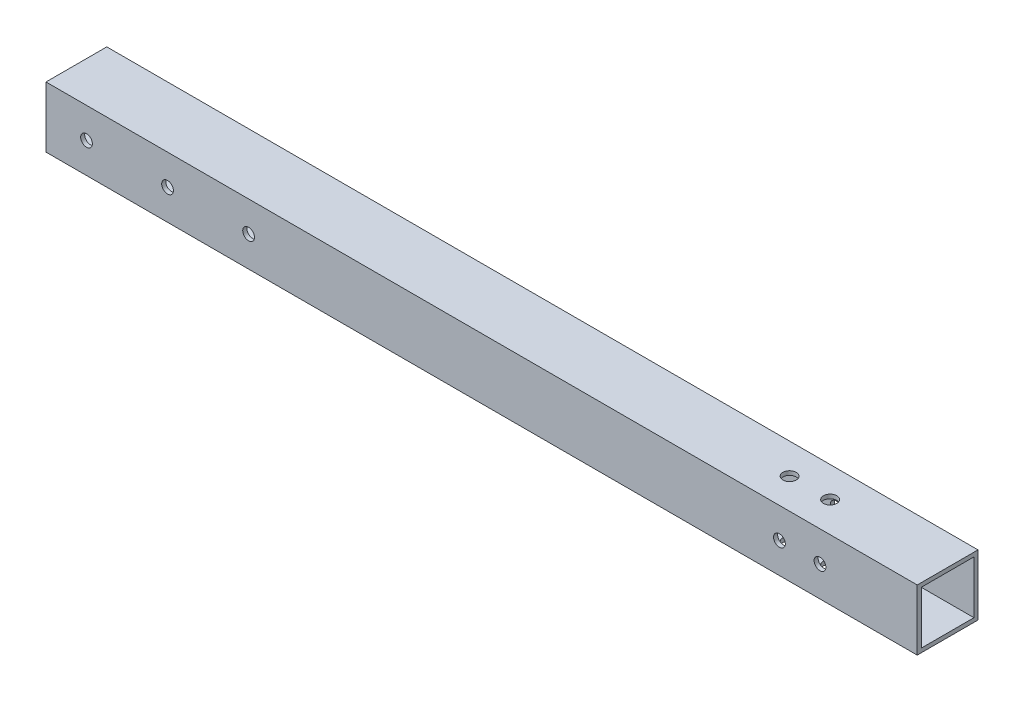
ISO-10303-21;
HEADER;
FILE_DESCRIPTION(('STEP AP214'),'2;1');
FILE_NAME('part.step','',(''),(''),'','','');
FILE_SCHEMA(('AUTOMOTIVE_DESIGN { 1 0 10303 214 1 1 1 1 }'));
ENDSEC;
DATA;
#1=APPLICATION_CONTEXT('core data for automotive mechanical design processes');
#2=APPLICATION_PROTOCOL_DEFINITION('international standard','automotive_design',2000,#1);
#3=PRODUCT_CONTEXT('',#1,'mechanical');
#4=PRODUCT('Part','Part','',(#3));
#5=PRODUCT_RELATED_PRODUCT_CATEGORY('part','',(#4));
#6=PRODUCT_DEFINITION_FORMATION('','',#4);
#7=PRODUCT_DEFINITION_CONTEXT('part definition',#1,'design');
#8=PRODUCT_DEFINITION('design','',#6,#7);
#9=PRODUCT_DEFINITION_SHAPE('','',#8);
#10=(LENGTH_UNIT() NAMED_UNIT(*) SI_UNIT(.MILLI.,.METRE.));
#11=(NAMED_UNIT(*) PLANE_ANGLE_UNIT() SI_UNIT($,.RADIAN.));
#12=(NAMED_UNIT(*) SI_UNIT($,.STERADIAN.) SOLID_ANGLE_UNIT());
#13=UNCERTAINTY_MEASURE_WITH_UNIT(LENGTH_MEASURE(1.E-05),#10,'distance_accuracy_value','');
#14=(GEOMETRIC_REPRESENTATION_CONTEXT(3) GLOBAL_UNCERTAINTY_ASSIGNED_CONTEXT((#13)) GLOBAL_UNIT_ASSIGNED_CONTEXT((#10,
#11,#12)) REPRESENTATION_CONTEXT('',''));
#15=CARTESIAN_POINT('',(0.,0.,0.));
#16=DIRECTION('',(0.,0.,1.));
#17=DIRECTION('',(1.,0.,0.));
#18=AXIS2_PLACEMENT_3D('',#15,#16,#17);
#19=CARTESIAN_POINT('',(215.,0.,0.));
#20=DIRECTION('',(-1.,0.,0.));
#21=DIRECTION('',(0.,0.,1.));
#22=AXIS2_PLACEMENT_3D('',#19,#20,#21);
#23=PLANE('',#22);
#24=DIRECTION('',(0.,1.,0.));
#25=VECTOR('',#24,1.);
#26=CARTESIAN_POINT('',(215.,-7.5,-7.5));
#27=LINE('',#26,#25);
#28=CARTESIAN_POINT('',(215.,-7.5,-7.5));
#29=VERTEX_POINT('',#28);
#30=CARTESIAN_POINT('',(215.,7.5,-7.5));
#31=VERTEX_POINT('',#30);
#32=EDGE_CURVE('E146',#29,#31,#27,.T.);
#33=ORIENTED_EDGE('',*,*,#32,.T.);
#34=DIRECTION('',(0.,0.,1.));
#35=VECTOR('',#34,1.);
#36=CARTESIAN_POINT('',(215.,7.5,7.5));
#37=LINE('',#36,#35);
#38=CARTESIAN_POINT('',(215.,7.5,7.5));
#39=VERTEX_POINT('',#38);
#40=EDGE_CURVE('E149',#31,#39,#37,.T.);
#41=ORIENTED_EDGE('',*,*,#40,.T.);
#42=DIRECTION('',(0.,-1.,0.));
#43=VECTOR('',#42,1.);
#44=CARTESIAN_POINT('',(215.,-7.5,7.5));
#45=LINE('',#44,#43);
#46=CARTESIAN_POINT('',(215.,-7.5,7.5));
#47=VERTEX_POINT('',#46);
#48=EDGE_CURVE('E152',#39,#47,#45,.T.);
#49=ORIENTED_EDGE('',*,*,#48,.T.);
#50=DIRECTION('',(0.,0.,-1.));
#51=VECTOR('',#50,1.);
#52=CARTESIAN_POINT('',(215.,-7.5,7.5));
#53=LINE('',#52,#51);
#54=EDGE_CURVE('E154',#47,#29,#53,.T.);
#55=ORIENTED_EDGE('',*,*,#54,.T.);
#56=EDGE_LOOP('',(#33,#41,#49,#55));
#57=FACE_BOUND('',#56,.T.);
#58=DIRECTION('',(0.,0.,-1.));
#59=VECTOR('',#58,1.);
#60=CARTESIAN_POINT('',(215.,-6.5,6.5));
#61=LINE('',#60,#59);
#62=CARTESIAN_POINT('',(215.,-6.5,6.5));
#63=VERTEX_POINT('',#62);
#64=CARTESIAN_POINT('',(215.,-6.5,-6.5));
#65=VERTEX_POINT('',#64);
#66=EDGE_CURVE('E108',#63,#65,#61,.T.);
#67=ORIENTED_EDGE('',*,*,#66,.F.);
#68=DIRECTION('',(0.,-1.,0.));
#69=VECTOR('',#68,1.);
#70=CARTESIAN_POINT('',(215.,-6.5,6.5));
#71=LINE('',#70,#69);
#72=CARTESIAN_POINT('',(215.,6.5,6.5));
#73=VERTEX_POINT('',#72);
#74=EDGE_CURVE('E130',#73,#63,#71,.T.);
#75=ORIENTED_EDGE('',*,*,#74,.F.);
#76=DIRECTION('',(0.,0.,1.));
#77=VECTOR('',#76,1.);
#78=CARTESIAN_POINT('',(215.,6.5,6.5));
#79=LINE('',#78,#77);
#80=CARTESIAN_POINT('',(215.,6.5,-6.5));
#81=VERTEX_POINT('',#80);
#82=EDGE_CURVE('E128',#81,#73,#79,.T.);
#83=ORIENTED_EDGE('',*,*,#82,.F.);
#84=DIRECTION('',(0.,1.,0.));
#85=VECTOR('',#84,1.);
#86=CARTESIAN_POINT('',(215.,-6.5,-6.5));
#87=LINE('',#86,#85);
#88=EDGE_CURVE('E116',#65,#81,#87,.T.);
#89=ORIENTED_EDGE('',*,*,#88,.F.);
#90=EDGE_LOOP('',(#67,#75,#83,#89));
#91=FACE_BOUND('',#90,.T.);
#92=ADVANCED_FACE('F41',(#57,#91),#23,.F.);
#93=CARTESIAN_POINT('',(0.,0.,0.));
#94=DIRECTION('',(-1.,0.,0.));
#95=DIRECTION('',(0.,0.,1.));
#96=AXIS2_PLACEMENT_3D('',#93,#94,#95);
#97=PLANE('',#96);
#98=DIRECTION('',(0.,1.,0.));
#99=VECTOR('',#98,1.);
#100=CARTESIAN_POINT('',(0.,-7.5,-7.5));
#101=LINE('',#100,#99);
#102=CARTESIAN_POINT('',(0.,-7.5,-7.5));
#103=VERTEX_POINT('',#102);
#104=CARTESIAN_POINT('',(0.,7.5,-7.5));
#105=VERTEX_POINT('',#104);
#106=EDGE_CURVE('E124',#103,#105,#101,.T.);
#107=ORIENTED_EDGE('',*,*,#106,.F.);
#108=DIRECTION('',(0.,0.,-1.));
#109=VECTOR('',#108,1.);
#110=CARTESIAN_POINT('',(0.,-7.5,7.5));
#111=LINE('',#110,#109);
#112=CARTESIAN_POINT('',(0.,-7.5,7.5));
#113=VERTEX_POINT('',#112);
#114=EDGE_CURVE('E150',#113,#103,#111,.T.);
#115=ORIENTED_EDGE('',*,*,#114,.F.);
#116=DIRECTION('',(0.,-1.,0.));
#117=VECTOR('',#116,1.);
#118=CARTESIAN_POINT('',(0.,-7.5,7.5));
#119=LINE('',#118,#117);
#120=CARTESIAN_POINT('',(0.,7.5,7.5));
#121=VERTEX_POINT('',#120);
#122=EDGE_CURVE('E161',#121,#113,#119,.T.);
#123=ORIENTED_EDGE('',*,*,#122,.F.);
#124=DIRECTION('',(0.,0.,1.));
#125=VECTOR('',#124,1.);
#126=CARTESIAN_POINT('',(0.,7.5,7.5));
#127=LINE('',#126,#125);
#128=EDGE_CURVE('E159',#105,#121,#127,.T.);
#129=ORIENTED_EDGE('',*,*,#128,.F.);
#130=EDGE_LOOP('',(#107,#115,#123,#129));
#131=FACE_BOUND('',#130,.T.);
#132=DIRECTION('',(0.,-1.,0.));
#133=VECTOR('',#132,1.);
#134=CARTESIAN_POINT('',(0.,-6.5,6.5));
#135=LINE('',#134,#133);
#136=CARTESIAN_POINT('',(0.,6.5,6.5));
#137=VERTEX_POINT('',#136);
#138=CARTESIAN_POINT('',(0.,-6.5,6.5));
#139=VERTEX_POINT('',#138);
#140=EDGE_CURVE('E117',#137,#139,#135,.T.);
#141=ORIENTED_EDGE('',*,*,#140,.T.);
#142=DIRECTION('',(0.,0.,-1.));
#143=VECTOR('',#142,1.);
#144=CARTESIAN_POINT('',(0.,-6.5,6.5));
#145=LINE('',#144,#143);
#146=CARTESIAN_POINT('',(0.,-6.5,-6.5));
#147=VERTEX_POINT('',#146);
#148=EDGE_CURVE('E66',#139,#147,#145,.T.);
#149=ORIENTED_EDGE('',*,*,#148,.T.);
#150=DIRECTION('',(0.,1.,0.));
#151=VECTOR('',#150,1.);
#152=CARTESIAN_POINT('',(0.,-6.5,-6.5));
#153=LINE('',#152,#151);
#154=CARTESIAN_POINT('',(0.,6.5,-6.5));
#155=VERTEX_POINT('',#154);
#156=EDGE_CURVE('E123',#147,#155,#153,.T.);
#157=ORIENTED_EDGE('',*,*,#156,.T.);
#158=DIRECTION('',(0.,0.,1.));
#159=VECTOR('',#158,1.);
#160=CARTESIAN_POINT('',(0.,6.5,6.5));
#161=LINE('',#160,#159);
#162=EDGE_CURVE('E138',#155,#137,#161,.T.);
#163=ORIENTED_EDGE('',*,*,#162,.T.);
#164=EDGE_LOOP('',(#141,#149,#157,#163));
#165=FACE_BOUND('',#164,.T.);
#166=ADVANCED_FACE('F281',(#131,#165),#97,.T.);
#167=CARTESIAN_POINT('',(215.,-7.5,-7.5));
#168=DIRECTION('',(0.,0.,1.));
#169=DIRECTION('',(1.,0.,0.));
#170=AXIS2_PLACEMENT_3D('',#167,#168,#169);
#171=PLANE('',#170);
#172=CARTESIAN_POINT('',(191.,0.,-7.5));
#173=DIRECTION('',(0.,0.,1.));
#174=DIRECTION('',(1.,0.,0.));
#175=AXIS2_PLACEMENT_3D('',#172,#173,#174);
#176=CIRCLE('',#175,1.44999999999997);
#177=CARTESIAN_POINT('',(192.45,0.,-7.5));
#178=VERTEX_POINT('',#177);
#179=EDGE_CURVE('E175',#178,#178,#176,.T.);
#180=ORIENTED_EDGE('',*,*,#179,.T.);
#181=EDGE_LOOP('',(#180));
#182=FACE_BOUND('',#181,.T.);
#183=CARTESIAN_POINT('',(181.,0.,-7.5));
#184=DIRECTION('',(0.,0.,1.));
#185=DIRECTION('',(1.,0.,0.));
#186=AXIS2_PLACEMENT_3D('',#183,#184,#185);
#187=CIRCLE('',#186,1.45);
#188=CARTESIAN_POINT('',(182.45,0.,-7.5));
#189=VERTEX_POINT('',#188);
#190=EDGE_CURVE('E224',#189,#189,#187,.T.);
#191=ORIENTED_EDGE('',*,*,#190,.T.);
#192=EDGE_LOOP('',(#191));
#193=FACE_BOUND('',#192,.T.);
#194=CARTESIAN_POINT('',(50.,0.,-7.5));
#195=DIRECTION('',(0.,0.,1.));
#196=DIRECTION('',(1.,0.,0.));
#197=AXIS2_PLACEMENT_3D('',#194,#195,#196);
#198=CIRCLE('',#197,1.45);
#199=CARTESIAN_POINT('',(51.45,0.,-7.5));
#200=VERTEX_POINT('',#199);
#201=EDGE_CURVE('E230',#200,#200,#198,.T.);
#202=ORIENTED_EDGE('',*,*,#201,.T.);
#203=EDGE_LOOP('',(#202));
#204=FACE_BOUND('',#203,.T.);
#205=CARTESIAN_POINT('',(30.,0.,-7.5));
#206=DIRECTION('',(0.,0.,1.));
#207=DIRECTION('',(1.,0.,0.));
#208=AXIS2_PLACEMENT_3D('',#205,#206,#207);
#209=CIRCLE('',#208,1.45);
#210=CARTESIAN_POINT('',(31.45,0.,-7.5));
#211=VERTEX_POINT('',#210);
#212=EDGE_CURVE('E236',#211,#211,#209,.T.);
#213=ORIENTED_EDGE('',*,*,#212,.T.);
#214=EDGE_LOOP('',(#213));
#215=FACE_BOUND('',#214,.T.);
#216=CARTESIAN_POINT('',(10.,0.,-7.5));
#217=DIRECTION('',(0.,0.,1.));
#218=DIRECTION('',(1.,0.,0.));
#219=AXIS2_PLACEMENT_3D('',#216,#217,#218);
#220=CIRCLE('',#219,1.45);
#221=CARTESIAN_POINT('',(11.45,0.,-7.5));
#222=VERTEX_POINT('',#221);
#223=EDGE_CURVE('E215',#222,#222,#220,.T.);
#224=ORIENTED_EDGE('',*,*,#223,.T.);
#225=EDGE_LOOP('',(#224));
#226=FACE_BOUND('',#225,.T.);
#227=ORIENTED_EDGE('',*,*,#106,.T.);
#228=DIRECTION('',(-1.,0.,0.));
#229=VECTOR('',#228,1.);
#230=CARTESIAN_POINT('',(215.,7.5,-7.5));
#231=LINE('',#230,#229);
#232=EDGE_CURVE('E11',#31,#105,#231,.T.);
#233=ORIENTED_EDGE('',*,*,#232,.F.);
#234=ORIENTED_EDGE('',*,*,#32,.F.);
#235=DIRECTION('',(-1.,0.,0.));
#236=VECTOR('',#235,1.);
#237=CARTESIAN_POINT('',(215.,-7.5,-7.5));
#238=LINE('',#237,#236);
#239=EDGE_CURVE('E156',#29,#103,#238,.T.);
#240=ORIENTED_EDGE('',*,*,#239,.T.);
#241=EDGE_LOOP('',(#227,#233,#234,#240));
#242=FACE_BOUND('',#241,.T.);
#243=ADVANCED_FACE('F43',(#182,#193,#204,#215,#226,#242),#171,.F.);
#244=CARTESIAN_POINT('',(215.,7.5,7.5));
#245=DIRECTION('',(0.,-1.,0.));
#246=DIRECTION('',(0.,0.,-1.));
#247=AXIS2_PLACEMENT_3D('',#244,#245,#246);
#248=PLANE('',#247);
#249=CARTESIAN_POINT('',(176.,7.5,0.));
#250=DIRECTION('',(0.,1.,0.));
#251=DIRECTION('',(0.,0.,1.));
#252=AXIS2_PLACEMENT_3D('',#249,#250,#251);
#253=CIRCLE('',#252,1.64999999999999);
#254=CARTESIAN_POINT('',(176.,7.5,1.64999999999998));
#255=VERTEX_POINT('',#254);
#256=EDGE_CURVE('E199',#255,#255,#253,.T.);
#257=ORIENTED_EDGE('',*,*,#256,.F.);
#258=EDGE_LOOP('',(#257));
#259=FACE_BOUND('',#258,.T.);
#260=CARTESIAN_POINT('',(186.,7.5,0.));
#261=DIRECTION('',(0.,1.,0.));
#262=DIRECTION('',(0.,0.,1.));
#263=AXIS2_PLACEMENT_3D('',#260,#261,#262);
#264=CIRCLE('',#263,1.65000000000002);
#265=CARTESIAN_POINT('',(186.,7.5,1.65));
#266=VERTEX_POINT('',#265);
#267=EDGE_CURVE('E204',#266,#266,#264,.T.);
#268=ORIENTED_EDGE('',*,*,#267,.F.);
#269=EDGE_LOOP('',(#268));
#270=FACE_BOUND('',#269,.T.);
#271=ORIENTED_EDGE('',*,*,#128,.T.);
#272=DIRECTION('',(-1.,0.,0.));
#273=VECTOR('',#272,1.);
#274=CARTESIAN_POINT('',(215.,7.5,7.5));
#275=LINE('',#274,#273);
#276=EDGE_CURVE('E50',#39,#121,#275,.T.);
#277=ORIENTED_EDGE('',*,*,#276,.F.);
#278=ORIENTED_EDGE('',*,*,#40,.F.);
#279=ORIENTED_EDGE('',*,*,#232,.T.);
#280=EDGE_LOOP('',(#271,#277,#278,#279));
#281=FACE_BOUND('',#280,.T.);
#282=ADVANCED_FACE('F280',(#259,#270,#281),#248,.F.);
#283=CARTESIAN_POINT('',(215.,-7.5,7.5));
#284=DIRECTION('',(0.,0.,-1.));
#285=DIRECTION('',(-1.,0.,0.));
#286=AXIS2_PLACEMENT_3D('',#283,#284,#285);
#287=PLANE('',#286);
#288=CARTESIAN_POINT('',(191.,0.,7.5));
#289=DIRECTION('',(0.,0.,1.));
#290=DIRECTION('',(1.,0.,0.));
#291=AXIS2_PLACEMENT_3D('',#288,#289,#290);
#292=CIRCLE('',#291,1.44999999999997);
#293=CARTESIAN_POINT('',(192.45,0.,7.5));
#294=VERTEX_POINT('',#293);
#295=EDGE_CURVE('E218',#294,#294,#292,.T.);
#296=ORIENTED_EDGE('',*,*,#295,.F.);
#297=EDGE_LOOP('',(#296));
#298=FACE_BOUND('',#297,.T.);
#299=CARTESIAN_POINT('',(181.,0.,7.5));
#300=DIRECTION('',(0.,0.,1.));
#301=DIRECTION('',(1.,0.,0.));
#302=AXIS2_PLACEMENT_3D('',#299,#300,#301);
#303=CIRCLE('',#302,1.45);
#304=CARTESIAN_POINT('',(182.45,0.,7.5));
#305=VERTEX_POINT('',#304);
#306=EDGE_CURVE('E221',#305,#305,#303,.T.);
#307=ORIENTED_EDGE('',*,*,#306,.F.);
#308=EDGE_LOOP('',(#307));
#309=FACE_BOUND('',#308,.T.);
#310=CARTESIAN_POINT('',(50.,0.,7.5));
#311=DIRECTION('',(0.,0.,1.));
#312=DIRECTION('',(1.,0.,0.));
#313=AXIS2_PLACEMENT_3D('',#310,#311,#312);
#314=CIRCLE('',#313,1.45);
#315=CARTESIAN_POINT('',(51.45,0.,7.5));
#316=VERTEX_POINT('',#315);
#317=EDGE_CURVE('E227',#316,#316,#314,.T.);
#318=ORIENTED_EDGE('',*,*,#317,.F.);
#319=EDGE_LOOP('',(#318));
#320=FACE_BOUND('',#319,.T.);
#321=CARTESIAN_POINT('',(30.,0.,7.5));
#322=DIRECTION('',(0.,0.,1.));
#323=DIRECTION('',(1.,0.,0.));
#324=AXIS2_PLACEMENT_3D('',#321,#322,#323);
#325=CIRCLE('',#324,1.45);
#326=CARTESIAN_POINT('',(31.45,0.,7.5));
#327=VERTEX_POINT('',#326);
#328=EDGE_CURVE('E233',#327,#327,#325,.T.);
#329=ORIENTED_EDGE('',*,*,#328,.F.);
#330=EDGE_LOOP('',(#329));
#331=FACE_BOUND('',#330,.T.);
#332=CARTESIAN_POINT('',(10.,0.,7.5));
#333=DIRECTION('',(0.,0.,1.));
#334=DIRECTION('',(1.,0.,0.));
#335=AXIS2_PLACEMENT_3D('',#332,#333,#334);
#336=CIRCLE('',#335,1.45);
#337=CARTESIAN_POINT('',(11.45,0.,7.5));
#338=VERTEX_POINT('',#337);
#339=EDGE_CURVE('E239',#338,#338,#336,.T.);
#340=ORIENTED_EDGE('',*,*,#339,.F.);
#341=EDGE_LOOP('',(#340));
#342=FACE_BOUND('',#341,.T.);
#343=ORIENTED_EDGE('',*,*,#122,.T.);
#344=DIRECTION('',(-1.,0.,0.));
#345=VECTOR('',#344,1.);
#346=CARTESIAN_POINT('',(215.,-7.5,7.5));
#347=LINE('',#346,#345);
#348=EDGE_CURVE('E166',#47,#113,#347,.T.);
#349=ORIENTED_EDGE('',*,*,#348,.F.);
#350=ORIENTED_EDGE('',*,*,#48,.F.);
#351=ORIENTED_EDGE('',*,*,#276,.T.);
#352=EDGE_LOOP('',(#343,#349,#350,#351));
#353=FACE_BOUND('',#352,.T.);
#354=ADVANCED_FACE('F300',(#298,#309,#320,#331,#342,#353),#287,.F.);
#355=CARTESIAN_POINT('',(215.,-7.5,7.5));
#356=DIRECTION('',(0.,1.,0.));
#357=DIRECTION('',(0.,0.,1.));
#358=AXIS2_PLACEMENT_3D('',#355,#356,#357);
#359=PLANE('',#358);
#360=CARTESIAN_POINT('',(176.,-7.5,0.));
#361=DIRECTION('',(0.,1.,0.));
#362=DIRECTION('',(0.,0.,1.));
#363=AXIS2_PLACEMENT_3D('',#360,#361,#362);
#364=CIRCLE('',#363,1.64999999999999);
#365=CARTESIAN_POINT('',(176.,-7.5,1.64999999999998));
#366=VERTEX_POINT('',#365);
#367=EDGE_CURVE('E193',#366,#366,#364,.T.);
#368=ORIENTED_EDGE('',*,*,#367,.T.);
#369=EDGE_LOOP('',(#368));
#370=FACE_BOUND('',#369,.T.);
#371=CARTESIAN_POINT('',(186.,-7.5,0.));
#372=DIRECTION('',(0.,1.,0.));
#373=DIRECTION('',(0.,0.,1.));
#374=AXIS2_PLACEMENT_3D('',#371,#372,#373);
#375=CIRCLE('',#374,1.65000000000002);
#376=CARTESIAN_POINT('',(186.,-7.5,1.65));
#377=VERTEX_POINT('',#376);
#378=EDGE_CURVE('E209',#377,#377,#375,.T.);
#379=ORIENTED_EDGE('',*,*,#378,.T.);
#380=EDGE_LOOP('',(#379));
#381=FACE_BOUND('',#380,.T.);
#382=ORIENTED_EDGE('',*,*,#114,.T.);
#383=ORIENTED_EDGE('',*,*,#239,.F.);
#384=ORIENTED_EDGE('',*,*,#54,.F.);
#385=ORIENTED_EDGE('',*,*,#348,.T.);
#386=EDGE_LOOP('',(#382,#383,#384,#385));
#387=FACE_BOUND('',#386,.T.);
#388=ADVANCED_FACE('F298',(#370,#381,#387),#359,.F.);
#389=CARTESIAN_POINT('',(215.,-6.5,6.5));
#390=DIRECTION('',(0.,1.,0.));
#391=DIRECTION('',(0.,0.,1.));
#392=AXIS2_PLACEMENT_3D('',#389,#390,#391);
#393=PLANE('',#392);
#394=CARTESIAN_POINT('',(176.,-6.5,0.));
#395=DIRECTION('',(0.,1.,0.));
#396=DIRECTION('',(0.,0.,1.));
#397=AXIS2_PLACEMENT_3D('',#394,#395,#396);
#398=CIRCLE('',#397,1.64999999999999);
#399=CARTESIAN_POINT('',(176.,-6.5,1.64999999999998));
#400=VERTEX_POINT('',#399);
#401=EDGE_CURVE('E212',#400,#400,#398,.T.);
#402=ORIENTED_EDGE('',*,*,#401,.F.);
#403=EDGE_LOOP('',(#402));
#404=FACE_BOUND('',#403,.T.);
#405=CARTESIAN_POINT('',(186.,-6.5,0.));
#406=DIRECTION('',(0.,1.,0.));
#407=DIRECTION('',(0.,0.,1.));
#408=AXIS2_PLACEMENT_3D('',#405,#406,#407);
#409=CIRCLE('',#408,1.65000000000002);
#410=CARTESIAN_POINT('',(186.,-6.5,1.65));
#411=VERTEX_POINT('',#410);
#412=EDGE_CURVE('E192',#411,#411,#409,.T.);
#413=ORIENTED_EDGE('',*,*,#412,.F.);
#414=EDGE_LOOP('',(#413));
#415=FACE_BOUND('',#414,.T.);
#416=ORIENTED_EDGE('',*,*,#148,.F.);
#417=DIRECTION('',(-1.,0.,0.));
#418=VECTOR('',#417,1.);
#419=CARTESIAN_POINT('',(215.,-6.5,6.5));
#420=LINE('',#419,#418);
#421=EDGE_CURVE('E112',#63,#139,#420,.T.);
#422=ORIENTED_EDGE('',*,*,#421,.F.);
#423=ORIENTED_EDGE('',*,*,#66,.T.);
#424=DIRECTION('',(-1.,0.,0.));
#425=VECTOR('',#424,1.);
#426=CARTESIAN_POINT('',(215.,-6.5,-6.5));
#427=LINE('',#426,#425);
#428=EDGE_CURVE('E111',#65,#147,#427,.T.);
#429=ORIENTED_EDGE('',*,*,#428,.T.);
#430=EDGE_LOOP('',(#416,#422,#423,#429));
#431=FACE_BOUND('',#430,.T.);
#432=ADVANCED_FACE('F110',(#404,#415,#431),#393,.T.);
#433=CARTESIAN_POINT('',(215.,-6.5,-6.5));
#434=DIRECTION('',(0.,0.,1.));
#435=DIRECTION('',(0.,-1.,0.));
#436=AXIS2_PLACEMENT_3D('',#433,#434,#435);
#437=PLANE('',#436);
#438=CARTESIAN_POINT('',(191.,0.,-6.5));
#439=DIRECTION('',(0.,0.,1.));
#440=DIRECTION('',(0.,-1.,0.));
#441=AXIS2_PLACEMENT_3D('',#438,#439,#440);
#442=CIRCLE('',#441,1.44999999999997);
#443=CARTESIAN_POINT('',(191.,-1.45000000000003,-6.5));
#444=VERTEX_POINT('',#443);
#445=EDGE_CURVE('E136',#444,#444,#442,.T.);
#446=ORIENTED_EDGE('',*,*,#445,.F.);
#447=EDGE_LOOP('',(#446));
#448=FACE_BOUND('',#447,.T.);
#449=CARTESIAN_POINT('',(181.,0.,-6.5));
#450=DIRECTION('',(0.,0.,1.));
#451=DIRECTION('',(0.,-1.,0.));
#452=AXIS2_PLACEMENT_3D('',#449,#450,#451);
#453=CIRCLE('',#452,1.45);
#454=CARTESIAN_POINT('',(181.,-1.45000000000006,-6.5));
#455=VERTEX_POINT('',#454);
#456=EDGE_CURVE('E187',#455,#455,#453,.T.);
#457=ORIENTED_EDGE('',*,*,#456,.F.);
#458=EDGE_LOOP('',(#457));
#459=FACE_BOUND('',#458,.T.);
#460=CARTESIAN_POINT('',(50.,0.,-6.5));
#461=DIRECTION('',(0.,0.,1.));
#462=DIRECTION('',(0.,-1.,0.));
#463=AXIS2_PLACEMENT_3D('',#460,#461,#462);
#464=CIRCLE('',#463,1.45);
#465=CARTESIAN_POINT('',(50.,-1.45000000000001,-6.5));
#466=VERTEX_POINT('',#465);
#467=EDGE_CURVE('E183',#466,#466,#464,.T.);
#468=ORIENTED_EDGE('',*,*,#467,.F.);
#469=EDGE_LOOP('',(#468));
#470=FACE_BOUND('',#469,.T.);
#471=CARTESIAN_POINT('',(30.,0.,-6.5));
#472=DIRECTION('',(0.,0.,1.));
#473=DIRECTION('',(0.,-1.,0.));
#474=AXIS2_PLACEMENT_3D('',#471,#472,#473);
#475=CIRCLE('',#474,1.45);
#476=CARTESIAN_POINT('',(30.,-1.45000000000001,-6.5));
#477=VERTEX_POINT('',#476);
#478=EDGE_CURVE('E179',#477,#477,#475,.T.);
#479=ORIENTED_EDGE('',*,*,#478,.F.);
#480=EDGE_LOOP('',(#479));
#481=FACE_BOUND('',#480,.T.);
#482=CARTESIAN_POINT('',(10.,0.,-6.5));
#483=DIRECTION('',(0.,0.,1.));
#484=DIRECTION('',(0.,-1.,0.));
#485=AXIS2_PLACEMENT_3D('',#482,#483,#484);
#486=CIRCLE('',#485,1.45);
#487=CARTESIAN_POINT('',(10.,-1.45000000000001,-6.5));
#488=VERTEX_POINT('',#487);
#489=EDGE_CURVE('E174',#488,#488,#486,.T.);
#490=ORIENTED_EDGE('',*,*,#489,.F.);
#491=EDGE_LOOP('',(#490));
#492=FACE_BOUND('',#491,.T.);
#493=ORIENTED_EDGE('',*,*,#156,.F.);
#494=ORIENTED_EDGE('',*,*,#428,.F.);
#495=ORIENTED_EDGE('',*,*,#88,.T.);
#496=DIRECTION('',(-1.,0.,0.));
#497=VECTOR('',#496,1.);
#498=CARTESIAN_POINT('',(215.,6.5,-6.5));
#499=LINE('',#498,#497);
#500=EDGE_CURVE('E125',#81,#155,#499,.T.);
#501=ORIENTED_EDGE('',*,*,#500,.T.);
#502=EDGE_LOOP('',(#493,#494,#495,#501));
#503=FACE_BOUND('',#502,.T.);
#504=ADVANCED_FACE('F120',(#448,#459,#470,#481,#492,#503),#437,.T.);
#505=CARTESIAN_POINT('',(215.,6.5,6.5));
#506=DIRECTION('',(0.,-1.,0.));
#507=DIRECTION('',(0.,0.,-1.));
#508=AXIS2_PLACEMENT_3D('',#505,#506,#507);
#509=PLANE('',#508);
#510=CARTESIAN_POINT('',(176.,6.5,0.));
#511=DIRECTION('',(0.,-1.,0.));
#512=DIRECTION('',(0.,0.,-1.));
#513=AXIS2_PLACEMENT_3D('',#510,#511,#512);
#514=CIRCLE('',#513,1.64999999999999);
#515=CARTESIAN_POINT('',(176.,6.5,-1.65));
#516=VERTEX_POINT('',#515);
#517=EDGE_CURVE('E45',#516,#516,#514,.T.);
#518=ORIENTED_EDGE('',*,*,#517,.F.);
#519=EDGE_LOOP('',(#518));
#520=FACE_BOUND('',#519,.T.);
#521=CARTESIAN_POINT('',(186.,6.5,0.));
#522=DIRECTION('',(0.,-1.,0.));
#523=DIRECTION('',(0.,0.,-1.));
#524=AXIS2_PLACEMENT_3D('',#521,#522,#523);
#525=CIRCLE('',#524,1.65000000000002);
#526=CARTESIAN_POINT('',(186.,6.5,-1.65000000000003));
#527=VERTEX_POINT('',#526);
#528=EDGE_CURVE('E190',#527,#527,#525,.T.);
#529=ORIENTED_EDGE('',*,*,#528,.F.);
#530=EDGE_LOOP('',(#529));
#531=FACE_BOUND('',#530,.T.);
#532=ORIENTED_EDGE('',*,*,#162,.F.);
#533=ORIENTED_EDGE('',*,*,#500,.F.);
#534=ORIENTED_EDGE('',*,*,#82,.T.);
#535=DIRECTION('',(-1.,0.,0.));
#536=VECTOR('',#535,1.);
#537=CARTESIAN_POINT('',(215.,6.5,6.5));
#538=LINE('',#537,#536);
#539=EDGE_CURVE('E58',#73,#137,#538,.T.);
#540=ORIENTED_EDGE('',*,*,#539,.T.);
#541=EDGE_LOOP('',(#532,#533,#534,#540));
#542=FACE_BOUND('',#541,.T.);
#543=ADVANCED_FACE('F259',(#520,#531,#542),#509,.T.);
#544=CARTESIAN_POINT('',(215.,-6.5,6.5));
#545=DIRECTION('',(0.,0.,-1.));
#546=DIRECTION('',(-1.,0.,0.));
#547=AXIS2_PLACEMENT_3D('',#544,#545,#546);
#548=PLANE('',#547);
#549=CARTESIAN_POINT('',(191.,0.,6.5));
#550=DIRECTION('',(0.,0.,-1.));
#551=DIRECTION('',(-1.,0.,0.));
#552=AXIS2_PLACEMENT_3D('',#549,#550,#551);
#553=CIRCLE('',#552,1.44999999999997);
#554=CARTESIAN_POINT('',(189.55,0.,6.5));
#555=VERTEX_POINT('',#554);
#556=EDGE_CURVE('E188',#555,#555,#553,.T.);
#557=ORIENTED_EDGE('',*,*,#556,.F.);
#558=EDGE_LOOP('',(#557));
#559=FACE_BOUND('',#558,.T.);
#560=CARTESIAN_POINT('',(181.,0.,6.5));
#561=DIRECTION('',(0.,0.,-1.));
#562=DIRECTION('',(-1.,0.,0.));
#563=AXIS2_PLACEMENT_3D('',#560,#561,#562);
#564=CIRCLE('',#563,1.45);
#565=CARTESIAN_POINT('',(179.55,0.,6.5));
#566=VERTEX_POINT('',#565);
#567=EDGE_CURVE('E184',#566,#566,#564,.T.);
#568=ORIENTED_EDGE('',*,*,#567,.F.);
#569=EDGE_LOOP('',(#568));
#570=FACE_BOUND('',#569,.T.);
#571=CARTESIAN_POINT('',(50.,0.,6.5));
#572=DIRECTION('',(0.,0.,-1.));
#573=DIRECTION('',(-1.,0.,0.));
#574=AXIS2_PLACEMENT_3D('',#571,#572,#573);
#575=CIRCLE('',#574,1.45);
#576=CARTESIAN_POINT('',(48.55,0.,6.5));
#577=VERTEX_POINT('',#576);
#578=EDGE_CURVE('E180',#577,#577,#575,.T.);
#579=ORIENTED_EDGE('',*,*,#578,.F.);
#580=EDGE_LOOP('',(#579));
#581=FACE_BOUND('',#580,.T.);
#582=CARTESIAN_POINT('',(30.,0.,6.5));
#583=DIRECTION('',(0.,0.,-1.));
#584=DIRECTION('',(-1.,0.,0.));
#585=AXIS2_PLACEMENT_3D('',#582,#583,#584);
#586=CIRCLE('',#585,1.45);
#587=CARTESIAN_POINT('',(28.55,0.,6.5));
#588=VERTEX_POINT('',#587);
#589=EDGE_CURVE('E176',#588,#588,#586,.T.);
#590=ORIENTED_EDGE('',*,*,#589,.F.);
#591=EDGE_LOOP('',(#590));
#592=FACE_BOUND('',#591,.T.);
#593=CARTESIAN_POINT('',(10.,0.,6.5));
#594=DIRECTION('',(0.,0.,-1.));
#595=DIRECTION('',(-1.,0.,0.));
#596=AXIS2_PLACEMENT_3D('',#593,#594,#595);
#597=CIRCLE('',#596,1.45);
#598=CARTESIAN_POINT('',(8.55000000000003,0.,6.5));
#599=VERTEX_POINT('',#598);
#600=EDGE_CURVE('E171',#599,#599,#597,.T.);
#601=ORIENTED_EDGE('',*,*,#600,.F.);
#602=EDGE_LOOP('',(#601));
#603=FACE_BOUND('',#602,.T.);
#604=ORIENTED_EDGE('',*,*,#140,.F.);
#605=ORIENTED_EDGE('',*,*,#539,.F.);
#606=ORIENTED_EDGE('',*,*,#74,.T.);
#607=ORIENTED_EDGE('',*,*,#421,.T.);
#608=EDGE_LOOP('',(#604,#605,#606,#607));
#609=FACE_BOUND('',#608,.T.);
#610=ADVANCED_FACE('F324',(#559,#570,#581,#592,#603,#609),#548,.T.);
#611=CARTESIAN_POINT('',(10.,0.,-7.5));
#612=DIRECTION('',(0.,0.,1.));
#613=DIRECTION('',(1.,0.,0.));
#614=AXIS2_PLACEMENT_3D('',#611,#612,#613);
#615=CYLINDRICAL_SURFACE('',#614,1.45);
#616=ORIENTED_EDGE('',*,*,#600,.T.);
#617=EDGE_LOOP('',(#616));
#618=FACE_BOUND('',#617,.T.);
#619=ORIENTED_EDGE('',*,*,#339,.T.);
#620=EDGE_LOOP('',(#619));
#621=FACE_BOUND('',#620,.T.);
#622=ADVANCED_FACE('F275',(#618,#621),#615,.F.);
#623=CARTESIAN_POINT('',(30.,0.,-7.5));
#624=DIRECTION('',(0.,0.,1.));
#625=DIRECTION('',(1.,0.,0.));
#626=AXIS2_PLACEMENT_3D('',#623,#624,#625);
#627=CYLINDRICAL_SURFACE('',#626,1.45);
#628=ORIENTED_EDGE('',*,*,#589,.T.);
#629=EDGE_LOOP('',(#628));
#630=FACE_BOUND('',#629,.T.);
#631=ORIENTED_EDGE('',*,*,#328,.T.);
#632=EDGE_LOOP('',(#631));
#633=FACE_BOUND('',#632,.T.);
#634=ADVANCED_FACE('F330',(#630,#633),#627,.F.);
#635=CARTESIAN_POINT('',(50.,0.,-7.5));
#636=DIRECTION('',(0.,0.,1.));
#637=DIRECTION('',(1.,0.,0.));
#638=AXIS2_PLACEMENT_3D('',#635,#636,#637);
#639=CYLINDRICAL_SURFACE('',#638,1.45);
#640=ORIENTED_EDGE('',*,*,#578,.T.);
#641=EDGE_LOOP('',(#640));
#642=FACE_BOUND('',#641,.T.);
#643=ORIENTED_EDGE('',*,*,#317,.T.);
#644=EDGE_LOOP('',(#643));
#645=FACE_BOUND('',#644,.T.);
#646=ADVANCED_FACE('F334',(#642,#645),#639,.F.);
#647=CARTESIAN_POINT('',(181.,0.,-7.5));
#648=DIRECTION('',(0.,0.,1.));
#649=DIRECTION('',(1.,0.,0.));
#650=AXIS2_PLACEMENT_3D('',#647,#648,#649);
#651=CYLINDRICAL_SURFACE('',#650,1.45);
#652=ORIENTED_EDGE('',*,*,#567,.T.);
#653=EDGE_LOOP('',(#652));
#654=FACE_BOUND('',#653,.T.);
#655=ORIENTED_EDGE('',*,*,#306,.T.);
#656=EDGE_LOOP('',(#655));
#657=FACE_BOUND('',#656,.T.);
#658=ADVANCED_FACE('F338',(#654,#657),#651,.F.);
#659=CARTESIAN_POINT('',(191.,0.,-7.5));
#660=DIRECTION('',(0.,0.,1.));
#661=DIRECTION('',(1.,0.,0.));
#662=AXIS2_PLACEMENT_3D('',#659,#660,#661);
#663=CYLINDRICAL_SURFACE('',#662,1.44999999999997);
#664=ORIENTED_EDGE('',*,*,#556,.T.);
#665=EDGE_LOOP('',(#664));
#666=FACE_BOUND('',#665,.T.);
#667=ORIENTED_EDGE('',*,*,#295,.T.);
#668=EDGE_LOOP('',(#667));
#669=FACE_BOUND('',#668,.T.);
#670=ADVANCED_FACE('F273',(#666,#669),#663,.F.);
#671=ORIENTED_EDGE('',*,*,#489,.T.);
#672=EDGE_LOOP('',(#671));
#673=FACE_BOUND('',#672,.T.);
#674=ORIENTED_EDGE('',*,*,#223,.F.);
#675=EDGE_LOOP('',(#674));
#676=FACE_BOUND('',#675,.T.);
#677=ADVANCED_FACE('F269',(#673,#676),#615,.F.);
#678=ORIENTED_EDGE('',*,*,#478,.T.);
#679=EDGE_LOOP('',(#678));
#680=FACE_BOUND('',#679,.T.);
#681=ORIENTED_EDGE('',*,*,#212,.F.);
#682=EDGE_LOOP('',(#681));
#683=FACE_BOUND('',#682,.T.);
#684=ADVANCED_FACE('F272',(#680,#683),#627,.F.);
#685=ORIENTED_EDGE('',*,*,#467,.T.);
#686=EDGE_LOOP('',(#685));
#687=FACE_BOUND('',#686,.T.);
#688=ORIENTED_EDGE('',*,*,#201,.F.);
#689=EDGE_LOOP('',(#688));
#690=FACE_BOUND('',#689,.T.);
#691=ADVANCED_FACE('F340',(#687,#690),#639,.F.);
#692=ORIENTED_EDGE('',*,*,#456,.T.);
#693=EDGE_LOOP('',(#692));
#694=FACE_BOUND('',#693,.T.);
#695=ORIENTED_EDGE('',*,*,#190,.F.);
#696=EDGE_LOOP('',(#695));
#697=FACE_BOUND('',#696,.T.);
#698=ADVANCED_FACE('F344',(#694,#697),#651,.F.);
#699=ORIENTED_EDGE('',*,*,#445,.T.);
#700=EDGE_LOOP('',(#699));
#701=FACE_BOUND('',#700,.T.);
#702=ORIENTED_EDGE('',*,*,#179,.F.);
#703=EDGE_LOOP('',(#702));
#704=FACE_BOUND('',#703,.T.);
#705=ADVANCED_FACE('F254',(#701,#704),#663,.F.);
#706=CARTESIAN_POINT('',(186.,-7.5,0.));
#707=DIRECTION('',(0.,1.,0.));
#708=DIRECTION('',(0.,0.,1.));
#709=AXIS2_PLACEMENT_3D('',#706,#707,#708);
#710=CYLINDRICAL_SURFACE('',#709,1.65000000000002);
#711=ORIENTED_EDGE('',*,*,#528,.T.);
#712=EDGE_LOOP('',(#711));
#713=FACE_BOUND('',#712,.T.);
#714=ORIENTED_EDGE('',*,*,#267,.T.);
#715=EDGE_LOOP('',(#714));
#716=FACE_BOUND('',#715,.T.);
#717=ADVANCED_FACE('F348',(#713,#716),#710,.F.);
#718=CARTESIAN_POINT('',(176.,-7.5,0.));
#719=DIRECTION('',(0.,1.,0.));
#720=DIRECTION('',(0.,0.,1.));
#721=AXIS2_PLACEMENT_3D('',#718,#719,#720);
#722=CYLINDRICAL_SURFACE('',#721,1.64999999999999);
#723=ORIENTED_EDGE('',*,*,#517,.T.);
#724=EDGE_LOOP('',(#723));
#725=FACE_BOUND('',#724,.T.);
#726=ORIENTED_EDGE('',*,*,#256,.T.);
#727=EDGE_LOOP('',(#726));
#728=FACE_BOUND('',#727,.T.);
#729=ADVANCED_FACE('F351',(#725,#728),#722,.F.);
#730=ORIENTED_EDGE('',*,*,#412,.T.);
#731=EDGE_LOOP('',(#730));
#732=FACE_BOUND('',#731,.T.);
#733=ORIENTED_EDGE('',*,*,#378,.F.);
#734=EDGE_LOOP('',(#733));
#735=FACE_BOUND('',#734,.T.);
#736=ADVANCED_FACE('F352',(#732,#735),#710,.F.);
#737=ORIENTED_EDGE('',*,*,#401,.T.);
#738=EDGE_LOOP('',(#737));
#739=FACE_BOUND('',#738,.T.);
#740=ORIENTED_EDGE('',*,*,#367,.F.);
#741=EDGE_LOOP('',(#740));
#742=FACE_BOUND('',#741,.T.);
#743=ADVANCED_FACE('F355',(#739,#742),#722,.F.);
#744=CLOSED_SHELL('',(#92,#166,#243,#282,#354,#388,#432,#504,#543,#610,#622,#634,#646,#658,#670,
#677,#684,#691,#698,#705,#717,#729,#736,#743));
#745=MANIFOLD_SOLID_BREP('B2',#744);
#746=ADVANCED_BREP_SHAPE_REPRESENTATION('',(#18,#745),#14);
#747=SHAPE_DEFINITION_REPRESENTATION(#9,#746);
ENDSEC;
END-ISO-10303-21;
